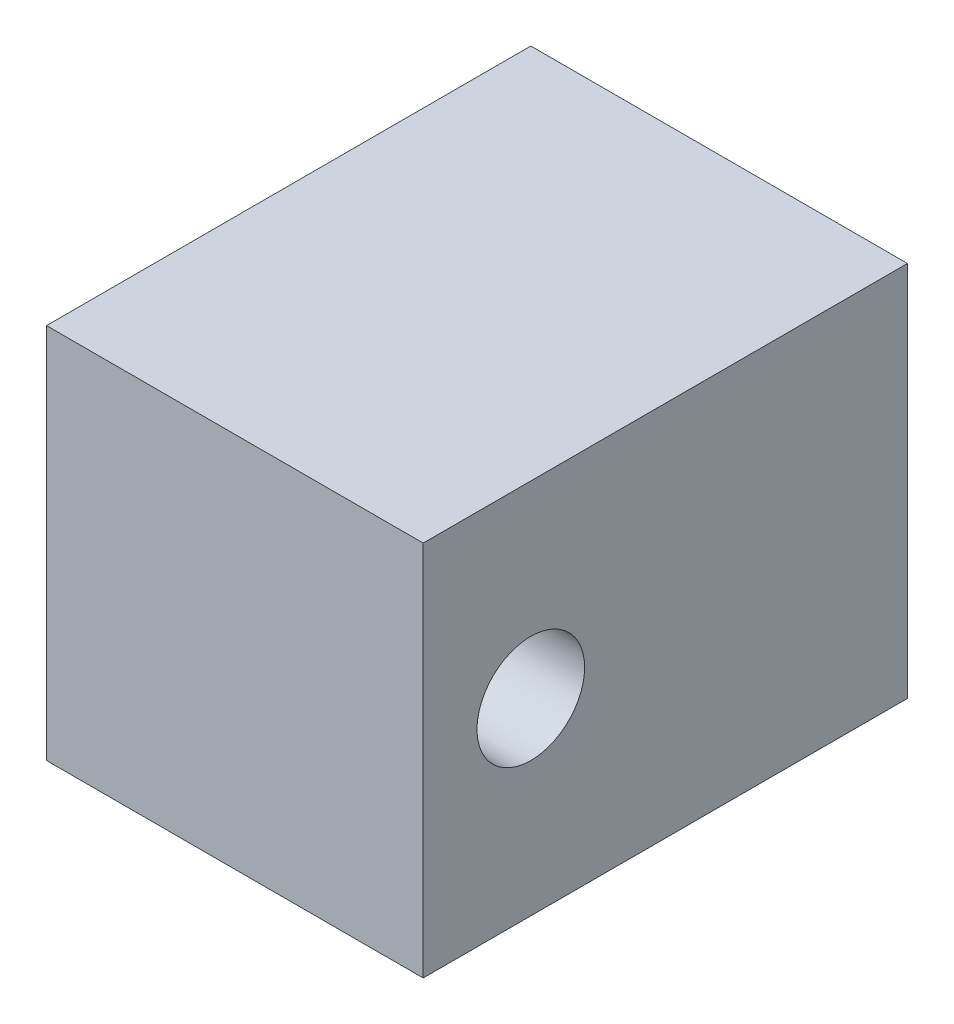
ISO-10303-21;
HEADER;
FILE_DESCRIPTION(('STEP AP214'),'2;1');
FILE_NAME('part.step','',(''),(''),'','','');
FILE_SCHEMA(('AUTOMOTIVE_DESIGN { 1 0 10303 214 1 1 1 1 }'));
ENDSEC;
DATA;
#1=APPLICATION_CONTEXT('core data for automotive mechanical design processes');
#2=APPLICATION_PROTOCOL_DEFINITION('international standard','automotive_design',2000,#1);
#3=PRODUCT_CONTEXT('',#1,'mechanical');
#4=PRODUCT('Part','Part','',(#3));
#5=PRODUCT_RELATED_PRODUCT_CATEGORY('part','',(#4));
#6=PRODUCT_DEFINITION_FORMATION('','',#4);
#7=PRODUCT_DEFINITION_CONTEXT('part definition',#1,'design');
#8=PRODUCT_DEFINITION('design','',#6,#7);
#9=PRODUCT_DEFINITION_SHAPE('','',#8);
#10=(LENGTH_UNIT() NAMED_UNIT(*) SI_UNIT(.MILLI.,.METRE.));
#11=(NAMED_UNIT(*) PLANE_ANGLE_UNIT() SI_UNIT($,.RADIAN.));
#12=(NAMED_UNIT(*) SI_UNIT($,.STERADIAN.) SOLID_ANGLE_UNIT());
#13=UNCERTAINTY_MEASURE_WITH_UNIT(LENGTH_MEASURE(1.E-05),#10,'distance_accuracy_value','');
#14=(GEOMETRIC_REPRESENTATION_CONTEXT(3) GLOBAL_UNCERTAINTY_ASSIGNED_CONTEXT((#13)) GLOBAL_UNIT_ASSIGNED_CONTEXT((#10,
#11,#12)) REPRESENTATION_CONTEXT('',''));
#15=CARTESIAN_POINT('',(0.,0.,0.));
#16=DIRECTION('',(0.,0.,1.));
#17=DIRECTION('',(1.,0.,0.));
#18=AXIS2_PLACEMENT_3D('',#15,#16,#17);
#19=CARTESIAN_POINT('',(0.,0.,0.));
#20=DIRECTION('',(0.,0.,-1.));
#21=DIRECTION('',(-1.,0.,0.));
#22=AXIS2_PLACEMENT_3D('',#19,#20,#21);
#23=PLANE('',#22);
#24=DIRECTION('',(0.,-1.,0.));
#25=VECTOR('',#24,1.);
#26=CARTESIAN_POINT('',(0.,0.,0.));
#27=LINE('',#26,#25);
#28=CARTESIAN_POINT('',(0.,14.,0.));
#29=VERTEX_POINT('',#28);
#30=CARTESIAN_POINT('',(0.,0.,0.));
#31=VERTEX_POINT('',#30);
#32=EDGE_CURVE('E112',#29,#31,#27,.T.);
#33=ORIENTED_EDGE('',*,*,#32,.F.);
#34=DIRECTION('',(-1.,0.,0.));
#35=VECTOR('',#34,1.);
#36=CARTESIAN_POINT('',(0.,14.,0.));
#37=LINE('',#36,#35);
#38=CARTESIAN_POINT('',(14.,14.,0.));
#39=VERTEX_POINT('',#38);
#40=EDGE_CURVE('E63',#39,#29,#37,.T.);
#41=ORIENTED_EDGE('',*,*,#40,.F.);
#42=DIRECTION('',(0.,1.,0.));
#43=VECTOR('',#42,1.);
#44=CARTESIAN_POINT('',(14.,0.,0.));
#45=LINE('',#44,#43);
#46=CARTESIAN_POINT('',(14.,0.,0.));
#47=VERTEX_POINT('',#46);
#48=EDGE_CURVE('E188',#47,#39,#45,.T.);
#49=ORIENTED_EDGE('',*,*,#48,.F.);
#50=DIRECTION('',(1.,0.,0.));
#51=VECTOR('',#50,1.);
#52=CARTESIAN_POINT('',(0.,0.,0.));
#53=LINE('',#52,#51);
#54=EDGE_CURVE('E185',#31,#47,#53,.T.);
#55=ORIENTED_EDGE('',*,*,#54,.F.);
#56=EDGE_LOOP('',(#33,#41,#49,#55));
#57=FACE_BOUND('',#56,.T.);
#58=DIRECTION('',(-1.,0.,0.));
#59=VECTOR('',#58,1.);
#60=CARTESIAN_POINT('',(1.,13.,0.));
#61=LINE('',#60,#59);
#62=CARTESIAN_POINT('',(13.,13.,0.));
#63=VERTEX_POINT('',#62);
#64=CARTESIAN_POINT('',(1.,13.,0.));
#65=VERTEX_POINT('',#64);
#66=EDGE_CURVE('E146',#63,#65,#61,.T.);
#67=ORIENTED_EDGE('',*,*,#66,.T.);
#68=DIRECTION('',(0.,-1.,0.));
#69=VECTOR('',#68,1.);
#70=CARTESIAN_POINT('',(1.,1.,0.));
#71=LINE('',#70,#69);
#72=CARTESIAN_POINT('',(1.,1.,0.));
#73=VERTEX_POINT('',#72);
#74=EDGE_CURVE('E55',#65,#73,#71,.T.);
#75=ORIENTED_EDGE('',*,*,#74,.T.);
#76=DIRECTION('',(1.,0.,0.));
#77=VECTOR('',#76,1.);
#78=CARTESIAN_POINT('',(1.,1.,0.));
#79=LINE('',#78,#77);
#80=CARTESIAN_POINT('',(13.,1.,0.));
#81=VERTEX_POINT('',#80);
#82=EDGE_CURVE('E161',#73,#81,#79,.T.);
#83=ORIENTED_EDGE('',*,*,#82,.T.);
#84=DIRECTION('',(0.,1.,0.));
#85=VECTOR('',#84,1.);
#86=CARTESIAN_POINT('',(13.,1.,0.));
#87=LINE('',#86,#85);
#88=EDGE_CURVE('E165',#81,#63,#87,.T.);
#89=ORIENTED_EDGE('',*,*,#88,.T.);
#90=EDGE_LOOP('',(#67,#75,#83,#89));
#91=FACE_BOUND('',#90,.T.);
#92=ADVANCED_FACE('F39',(#57,#91),#23,.T.);
#93=CARTESIAN_POINT('',(0.,0.,10.));
#94=DIRECTION('',(1.,0.,0.));
#95=DIRECTION('',(0.,0.,-1.));
#96=AXIS2_PLACEMENT_3D('',#93,#94,#95);
#97=PLANE('',#96);
#98=CARTESIAN_POINT('',(0.,7.,14.));
#99=DIRECTION('',(1.,0.,0.));
#100=DIRECTION('',(0.,0.,-1.));
#101=AXIS2_PLACEMENT_3D('',#98,#99,#100);
#102=CIRCLE('',#101,2.);
#103=CARTESIAN_POINT('',(0.,7.,12.));
#104=VERTEX_POINT('',#103);
#105=EDGE_CURVE('E129',#104,#104,#102,.T.);
#106=ORIENTED_EDGE('',*,*,#105,.T.);
#107=EDGE_LOOP('',(#106));
#108=FACE_BOUND('',#107,.T.);
#109=ORIENTED_EDGE('',*,*,#32,.T.);
#110=DIRECTION('',(0.,0.,-1.));
#111=VECTOR('',#110,1.);
#112=CARTESIAN_POINT('',(0.,0.,10.));
#113=LINE('',#112,#111);
#114=CARTESIAN_POINT('',(0.,0.,18.));
#115=VERTEX_POINT('',#114);
#116=EDGE_CURVE('E11',#115,#31,#113,.T.);
#117=ORIENTED_EDGE('',*,*,#116,.F.);
#118=DIRECTION('',(0.,-1.,0.));
#119=VECTOR('',#118,1.);
#120=CARTESIAN_POINT('',(0.,14.,18.));
#121=LINE('',#120,#119);
#122=CARTESIAN_POINT('',(0.,14.,18.));
#123=VERTEX_POINT('',#122);
#124=EDGE_CURVE('E110',#123,#115,#121,.T.);
#125=ORIENTED_EDGE('',*,*,#124,.F.);
#126=DIRECTION('',(0.,0.,-1.));
#127=VECTOR('',#126,1.);
#128=CARTESIAN_POINT('',(0.,14.,10.));
#129=LINE('',#128,#127);
#130=EDGE_CURVE('E193',#123,#29,#129,.T.);
#131=ORIENTED_EDGE('',*,*,#130,.T.);
#132=EDGE_LOOP('',(#109,#117,#125,#131));
#133=FACE_BOUND('',#132,.T.);
#134=ADVANCED_FACE('F41',(#108,#133),#97,.F.);
#135=CARTESIAN_POINT('',(0.,0.,10.));
#136=DIRECTION('',(0.,1.,0.));
#137=DIRECTION('',(0.,0.,1.));
#138=AXIS2_PLACEMENT_3D('',#135,#136,#137);
#139=PLANE('',#138);
#140=ORIENTED_EDGE('',*,*,#54,.T.);
#141=DIRECTION('',(0.,0.,-1.));
#142=VECTOR('',#141,1.);
#143=CARTESIAN_POINT('',(14.,0.,10.));
#144=LINE('',#143,#142);
#145=CARTESIAN_POINT('',(14.,0.,18.));
#146=VERTEX_POINT('',#145);
#147=EDGE_CURVE('E48',#146,#47,#144,.T.);
#148=ORIENTED_EDGE('',*,*,#147,.F.);
#149=DIRECTION('',(1.,0.,0.));
#150=VECTOR('',#149,1.);
#151=CARTESIAN_POINT('',(0.,0.,18.));
#152=LINE('',#151,#150);
#153=EDGE_CURVE('E115',#115,#146,#152,.T.);
#154=ORIENTED_EDGE('',*,*,#153,.F.);
#155=ORIENTED_EDGE('',*,*,#116,.T.);
#156=EDGE_LOOP('',(#140,#148,#154,#155));
#157=FACE_BOUND('',#156,.T.);
#158=ADVANCED_FACE('F116',(#157),#139,.F.);
#159=CARTESIAN_POINT('',(14.,0.,10.));
#160=DIRECTION('',(-1.,0.,0.));
#161=DIRECTION('',(0.,0.,1.));
#162=AXIS2_PLACEMENT_3D('',#159,#160,#161);
#163=PLANE('',#162);
#164=CARTESIAN_POINT('',(14.,7.,14.));
#165=DIRECTION('',(1.,0.,0.));
#166=DIRECTION('',(0.,0.,-1.));
#167=AXIS2_PLACEMENT_3D('',#164,#165,#166);
#168=CIRCLE('',#167,2.);
#169=CARTESIAN_POINT('',(14.,7.,12.));
#170=VERTEX_POINT('',#169);
#171=EDGE_CURVE('E133',#170,#170,#168,.T.);
#172=ORIENTED_EDGE('',*,*,#171,.F.);
#173=EDGE_LOOP('',(#172));
#174=FACE_BOUND('',#173,.T.);
#175=ORIENTED_EDGE('',*,*,#48,.T.);
#176=DIRECTION('',(0.,0.,-1.));
#177=VECTOR('',#176,1.);
#178=CARTESIAN_POINT('',(14.,14.,10.));
#179=LINE('',#178,#177);
#180=CARTESIAN_POINT('',(14.,14.,18.));
#181=VERTEX_POINT('',#180);
#182=EDGE_CURVE('E196',#181,#39,#179,.T.);
#183=ORIENTED_EDGE('',*,*,#182,.F.);
#184=DIRECTION('',(0.,1.,0.));
#185=VECTOR('',#184,1.);
#186=CARTESIAN_POINT('',(14.,14.,18.));
#187=LINE('',#186,#185);
#188=EDGE_CURVE('E122',#146,#181,#187,.T.);
#189=ORIENTED_EDGE('',*,*,#188,.F.);
#190=ORIENTED_EDGE('',*,*,#147,.T.);
#191=EDGE_LOOP('',(#175,#183,#189,#190));
#192=FACE_BOUND('',#191,.T.);
#193=ADVANCED_FACE('F201',(#174,#192),#163,.F.);
#194=CARTESIAN_POINT('',(0.,14.,10.));
#195=DIRECTION('',(0.,-1.,0.));
#196=DIRECTION('',(0.,0.,-1.));
#197=AXIS2_PLACEMENT_3D('',#194,#195,#196);
#198=PLANE('',#197);
#199=ORIENTED_EDGE('',*,*,#40,.T.);
#200=ORIENTED_EDGE('',*,*,#130,.F.);
#201=DIRECTION('',(-1.,0.,0.));
#202=VECTOR('',#201,1.);
#203=CARTESIAN_POINT('',(0.,14.,18.));
#204=LINE('',#203,#202);
#205=EDGE_CURVE('E127',#181,#123,#204,.T.);
#206=ORIENTED_EDGE('',*,*,#205,.F.);
#207=ORIENTED_EDGE('',*,*,#182,.T.);
#208=EDGE_LOOP('',(#199,#200,#206,#207));
#209=FACE_BOUND('',#208,.T.);
#210=ADVANCED_FACE('F236',(#209),#198,.F.);
#211=CARTESIAN_POINT('',(1.,1.,10.));
#212=DIRECTION('',(1.,0.,0.));
#213=DIRECTION('',(0.,0.,-1.));
#214=AXIS2_PLACEMENT_3D('',#211,#212,#213);
#215=PLANE('',#214);
#216=ORIENTED_EDGE('',*,*,#74,.F.);
#217=DIRECTION('',(0.,0.,-1.));
#218=VECTOR('',#217,1.);
#219=CARTESIAN_POINT('',(1.,13.,10.));
#220=LINE('',#219,#218);
#221=CARTESIAN_POINT('',(1.,13.,10.));
#222=VERTEX_POINT('',#221);
#223=EDGE_CURVE('E158',#222,#65,#220,.T.);
#224=ORIENTED_EDGE('',*,*,#223,.F.);
#225=DIRECTION('',(0.,-1.,0.));
#226=VECTOR('',#225,1.);
#227=CARTESIAN_POINT('',(1.,1.,10.));
#228=LINE('',#227,#226);
#229=CARTESIAN_POINT('',(1.,1.,10.));
#230=VERTEX_POINT('',#229);
#231=EDGE_CURVE('E141',#222,#230,#228,.T.);
#232=ORIENTED_EDGE('',*,*,#231,.T.);
#233=DIRECTION('',(0.,0.,-1.));
#234=VECTOR('',#233,1.);
#235=CARTESIAN_POINT('',(1.,1.,10.));
#236=LINE('',#235,#234);
#237=EDGE_CURVE('E180',#230,#73,#236,.T.);
#238=ORIENTED_EDGE('',*,*,#237,.T.);
#239=EDGE_LOOP('',(#216,#224,#232,#238));
#240=FACE_BOUND('',#239,.T.);
#241=ADVANCED_FACE('F211',(#240),#215,.T.);
#242=CARTESIAN_POINT('',(1.,1.,10.));
#243=DIRECTION('',(0.,1.,0.));
#244=DIRECTION('',(0.,0.,1.));
#245=AXIS2_PLACEMENT_3D('',#242,#243,#244);
#246=PLANE('',#245);
#247=ORIENTED_EDGE('',*,*,#82,.F.);
#248=ORIENTED_EDGE('',*,*,#237,.F.);
#249=DIRECTION('',(1.,0.,0.));
#250=VECTOR('',#249,1.);
#251=CARTESIAN_POINT('',(1.,1.,10.));
#252=LINE('',#251,#250);
#253=CARTESIAN_POINT('',(13.,1.,10.));
#254=VERTEX_POINT('',#253);
#255=EDGE_CURVE('E145',#230,#254,#252,.T.);
#256=ORIENTED_EDGE('',*,*,#255,.T.);
#257=DIRECTION('',(0.,0.,-1.));
#258=VECTOR('',#257,1.);
#259=CARTESIAN_POINT('',(13.,1.,10.));
#260=LINE('',#259,#258);
#261=EDGE_CURVE('E177',#254,#81,#260,.T.);
#262=ORIENTED_EDGE('',*,*,#261,.T.);
#263=EDGE_LOOP('',(#247,#248,#256,#262));
#264=FACE_BOUND('',#263,.T.);
#265=ADVANCED_FACE('F215',(#264),#246,.T.);
#266=CARTESIAN_POINT('',(13.,1.,10.));
#267=DIRECTION('',(-1.,0.,0.));
#268=DIRECTION('',(0.,-1.,0.));
#269=AXIS2_PLACEMENT_3D('',#266,#267,#268);
#270=PLANE('',#269);
#271=ORIENTED_EDGE('',*,*,#88,.F.);
#272=ORIENTED_EDGE('',*,*,#261,.F.);
#273=DIRECTION('',(0.,1.,0.));
#274=VECTOR('',#273,1.);
#275=CARTESIAN_POINT('',(13.,1.,10.));
#276=LINE('',#275,#274);
#277=CARTESIAN_POINT('',(13.,13.,10.));
#278=VERTEX_POINT('',#277);
#279=EDGE_CURVE('E150',#254,#278,#276,.T.);
#280=ORIENTED_EDGE('',*,*,#279,.T.);
#281=DIRECTION('',(0.,0.,-1.));
#282=VECTOR('',#281,1.);
#283=CARTESIAN_POINT('',(13.,13.,10.));
#284=LINE('',#283,#282);
#285=EDGE_CURVE('E174',#278,#63,#284,.T.);
#286=ORIENTED_EDGE('',*,*,#285,.T.);
#287=EDGE_LOOP('',(#271,#272,#280,#286));
#288=FACE_BOUND('',#287,.T.);
#289=ADVANCED_FACE('F218',(#288),#270,.T.);
#290=CARTESIAN_POINT('',(1.,13.,10.));
#291=DIRECTION('',(0.,-1.,0.));
#292=DIRECTION('',(0.,0.,-1.));
#293=AXIS2_PLACEMENT_3D('',#290,#291,#292);
#294=PLANE('',#293);
#295=ORIENTED_EDGE('',*,*,#66,.F.);
#296=ORIENTED_EDGE('',*,*,#285,.F.);
#297=DIRECTION('',(-1.,0.,0.));
#298=VECTOR('',#297,1.);
#299=CARTESIAN_POINT('',(1.,13.,10.));
#300=LINE('',#299,#298);
#301=EDGE_CURVE('E154',#278,#222,#300,.T.);
#302=ORIENTED_EDGE('',*,*,#301,.T.);
#303=ORIENTED_EDGE('',*,*,#223,.T.);
#304=EDGE_LOOP('',(#295,#296,#302,#303));
#305=FACE_BOUND('',#304,.T.);
#306=ADVANCED_FACE('F210',(#305),#294,.T.);
#307=CARTESIAN_POINT('',(0.,0.,10.));
#308=DIRECTION('',(0.,0.,1.));
#309=DIRECTION('',(1.,0.,0.));
#310=AXIS2_PLACEMENT_3D('',#307,#308,#309);
#311=PLANE('',#310);
#312=ORIENTED_EDGE('',*,*,#231,.F.);
#313=ORIENTED_EDGE('',*,*,#301,.F.);
#314=ORIENTED_EDGE('',*,*,#279,.F.);
#315=ORIENTED_EDGE('',*,*,#255,.F.);
#316=EDGE_LOOP('',(#312,#313,#314,#315));
#317=FACE_BOUND('',#316,.T.);
#318=ADVANCED_FACE('F219',(#317),#311,.F.);
#319=CARTESIAN_POINT('',(0.,0.,18.));
#320=DIRECTION('',(0.,0.,1.));
#321=DIRECTION('',(1.,0.,0.));
#322=AXIS2_PLACEMENT_3D('',#319,#320,#321);
#323=PLANE('',#322);
#324=ORIENTED_EDGE('',*,*,#124,.T.);
#325=ORIENTED_EDGE('',*,*,#153,.T.);
#326=ORIENTED_EDGE('',*,*,#188,.T.);
#327=ORIENTED_EDGE('',*,*,#205,.T.);
#328=EDGE_LOOP('',(#324,#325,#326,#327));
#329=FACE_BOUND('',#328,.T.);
#330=ADVANCED_FACE('F125',(#329),#323,.T.);
#331=CARTESIAN_POINT('',(0.,7.,14.));
#332=DIRECTION('',(1.,0.,0.));
#333=DIRECTION('',(0.,0.,-1.));
#334=AXIS2_PLACEMENT_3D('',#331,#332,#333);
#335=CYLINDRICAL_SURFACE('',#334,2.);
#336=ORIENTED_EDGE('',*,*,#105,.F.);
#337=EDGE_LOOP('',(#336));
#338=FACE_BOUND('',#337,.T.);
#339=ORIENTED_EDGE('',*,*,#171,.T.);
#340=EDGE_LOOP('',(#339));
#341=FACE_BOUND('',#340,.T.);
#342=ADVANCED_FACE('F226',(#338,#341),#335,.F.);
#343=CLOSED_SHELL('',(#92,#134,#158,#193,#210,#241,#265,#289,#306,#318,#330,#342));
#344=MANIFOLD_SOLID_BREP('B2',#343);
#345=ADVANCED_BREP_SHAPE_REPRESENTATION('',(#18,#344),#14);
#346=SHAPE_DEFINITION_REPRESENTATION(#9,#345);
ENDSEC;
END-ISO-10303-21;
